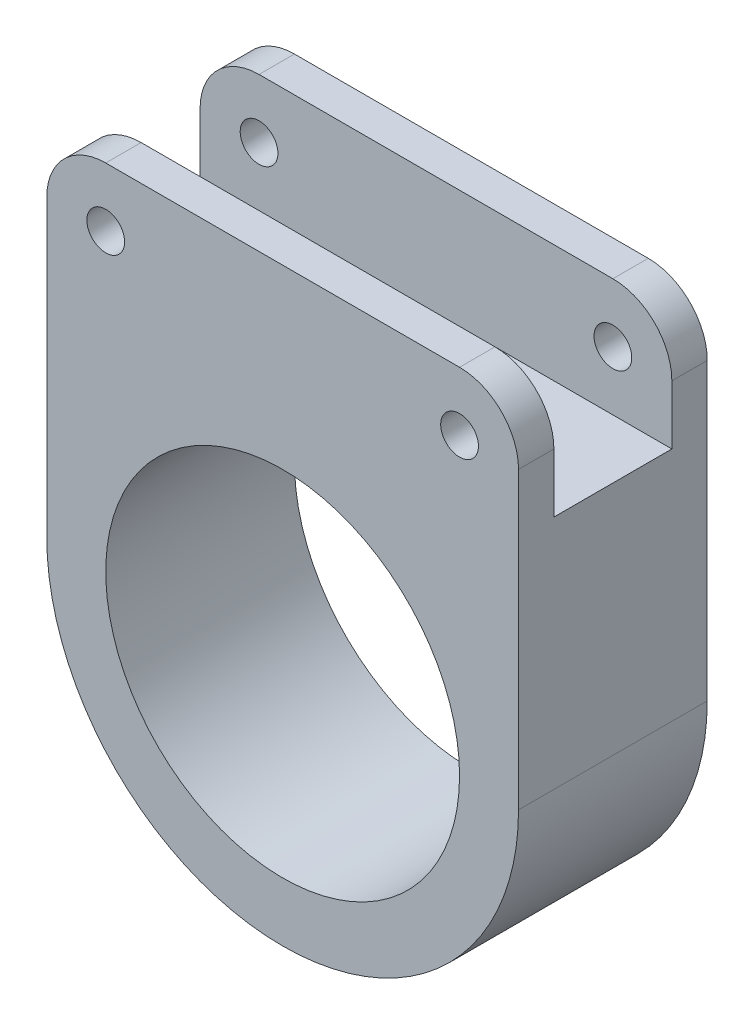
ISO-10303-21;
HEADER;
FILE_DESCRIPTION(('STEP AP214'),'2;1');
FILE_NAME('part.step','',(''),(''),'','','');
FILE_SCHEMA(('AUTOMOTIVE_DESIGN { 1 0 10303 214 1 1 1 1 }'));
ENDSEC;
DATA;
#1=APPLICATION_CONTEXT('core data for automotive mechanical design processes');
#2=APPLICATION_PROTOCOL_DEFINITION('international standard','automotive_design',2000,#1);
#3=PRODUCT_CONTEXT('',#1,'mechanical');
#4=PRODUCT('Part','Part','',(#3));
#5=PRODUCT_RELATED_PRODUCT_CATEGORY('part','',(#4));
#6=PRODUCT_DEFINITION_FORMATION('','',#4);
#7=PRODUCT_DEFINITION_CONTEXT('part definition',#1,'design');
#8=PRODUCT_DEFINITION('design','',#6,#7);
#9=PRODUCT_DEFINITION_SHAPE('','',#8);
#10=(LENGTH_UNIT() NAMED_UNIT(*) SI_UNIT(.MILLI.,.METRE.));
#11=(NAMED_UNIT(*) PLANE_ANGLE_UNIT() SI_UNIT($,.RADIAN.));
#12=(NAMED_UNIT(*) SI_UNIT($,.STERADIAN.) SOLID_ANGLE_UNIT());
#13=UNCERTAINTY_MEASURE_WITH_UNIT(LENGTH_MEASURE(1.E-05),#10,'distance_accuracy_value','');
#14=(GEOMETRIC_REPRESENTATION_CONTEXT(3) GLOBAL_UNCERTAINTY_ASSIGNED_CONTEXT((#13)) GLOBAL_UNIT_ASSIGNED_CONTEXT((#10,
#11,#12)) REPRESENTATION_CONTEXT('',''));
#15=CARTESIAN_POINT('',(0.,0.,0.));
#16=DIRECTION('',(0.,0.,1.));
#17=DIRECTION('',(1.,0.,0.));
#18=AXIS2_PLACEMENT_3D('',#15,#16,#17);
#19=CARTESIAN_POINT('',(0.,25.,16.));
#20=DIRECTION('',(0.,1.,0.));
#21=DIRECTION('',(0.,0.,1.));
#22=AXIS2_PLACEMENT_3D('',#19,#20,#21);
#23=PLANE('',#22);
#24=DIRECTION('',(1.,0.,0.));
#25=VECTOR('',#24,1.);
#26=CARTESIAN_POINT('',(0.,25.,16.));
#27=LINE('',#26,#25);
#28=CARTESIAN_POINT('',(-15.,25.,16.));
#29=VERTEX_POINT('',#28);
#30=CARTESIAN_POINT('',(15.,25.,16.));
#31=VERTEX_POINT('',#30);
#32=EDGE_CURVE('E173',#29,#31,#27,.T.);
#33=ORIENTED_EDGE('',*,*,#32,.T.);
#34=DIRECTION('',(0.,0.,-1.));
#35=VECTOR('',#34,1.);
#36=CARTESIAN_POINT('',(15.,25.,16.));
#37=LINE('',#36,#35);
#38=CARTESIAN_POINT('',(15.,25.,13.));
#39=VERTEX_POINT('',#38);
#40=EDGE_CURVE('E212',#31,#39,#37,.T.);
#41=ORIENTED_EDGE('',*,*,#40,.T.);
#42=DIRECTION('',(1.,0.,0.));
#43=VECTOR('',#42,1.);
#44=CARTESIAN_POINT('',(-20.,25.,13.));
#45=LINE('',#44,#43);
#46=CARTESIAN_POINT('',(-15.,25.,13.));
#47=VERTEX_POINT('',#46);
#48=EDGE_CURVE('E141',#47,#39,#45,.T.);
#49=ORIENTED_EDGE('',*,*,#48,.F.);
#50=DIRECTION('',(0.,0.,-1.));
#51=VECTOR('',#50,1.);
#52=CARTESIAN_POINT('',(-15.,25.,16.));
#53=LINE('',#52,#51);
#54=EDGE_CURVE('E210',#47,#29,#53,.F.);
#55=ORIENTED_EDGE('',*,*,#54,.T.);
#56=EDGE_LOOP('',(#33,#41,#49,#55));
#57=FACE_BOUND('',#56,.T.);
#58=ADVANCED_FACE('F33',(#57),#23,.T.);
#59=CARTESIAN_POINT('',(-15.,20.,16.));
#60=DIRECTION('',(0.,0.,-1.));
#61=DIRECTION('',(-1.,0.,0.));
#62=AXIS2_PLACEMENT_3D('',#59,#60,#61);
#63=CYLINDRICAL_SURFACE('',#62,1.6);
#64=CARTESIAN_POINT('',(-15.,20.,13.));
#65=DIRECTION('',(0.,0.,1.));
#66=DIRECTION('',(1.,0.,0.));
#67=AXIS2_PLACEMENT_3D('',#64,#65,#66);
#68=CIRCLE('',#67,1.6);
#69=CARTESIAN_POINT('',(-13.4,20.,13.));
#70=VERTEX_POINT('',#69);
#71=EDGE_CURVE('E163',#70,#70,#68,.T.);
#72=ORIENTED_EDGE('',*,*,#71,.F.);
#73=EDGE_LOOP('',(#72));
#74=FACE_BOUND('',#73,.T.);
#75=CARTESIAN_POINT('',(-15.,20.,16.));
#76=DIRECTION('',(0.,0.,1.));
#77=DIRECTION('',(1.,0.,0.));
#78=AXIS2_PLACEMENT_3D('',#75,#76,#77);
#79=CIRCLE('',#78,1.6);
#80=CARTESIAN_POINT('',(-13.4,20.,16.));
#81=VERTEX_POINT('',#80);
#82=EDGE_CURVE('E181',#81,#81,#79,.T.);
#83=ORIENTED_EDGE('',*,*,#82,.T.);
#84=EDGE_LOOP('',(#83));
#85=FACE_BOUND('',#84,.T.);
#86=ADVANCED_FACE('F294',(#74,#85),#63,.F.);
#87=CARTESIAN_POINT('',(15.,20.,16.));
#88=DIRECTION('',(0.,0.,-1.));
#89=DIRECTION('',(-1.,0.,0.));
#90=AXIS2_PLACEMENT_3D('',#87,#88,#89);
#91=CYLINDRICAL_SURFACE('',#90,1.6);
#92=CARTESIAN_POINT('',(15.,20.,13.));
#93=DIRECTION('',(0.,0.,1.));
#94=DIRECTION('',(1.,0.,0.));
#95=AXIS2_PLACEMENT_3D('',#92,#93,#94);
#96=CIRCLE('',#95,1.6);
#97=CARTESIAN_POINT('',(16.6,20.,13.));
#98=VERTEX_POINT('',#97);
#99=EDGE_CURVE('E160',#98,#98,#96,.T.);
#100=ORIENTED_EDGE('',*,*,#99,.F.);
#101=EDGE_LOOP('',(#100));
#102=FACE_BOUND('',#101,.T.);
#103=CARTESIAN_POINT('',(15.,20.,16.));
#104=DIRECTION('',(0.,0.,1.));
#105=DIRECTION('',(1.,0.,0.));
#106=AXIS2_PLACEMENT_3D('',#103,#104,#105);
#107=CIRCLE('',#106,1.6);
#108=CARTESIAN_POINT('',(16.6,20.,16.));
#109=VERTEX_POINT('',#108);
#110=EDGE_CURVE('E178',#109,#109,#107,.T.);
#111=ORIENTED_EDGE('',*,*,#110,.T.);
#112=EDGE_LOOP('',(#111));
#113=FACE_BOUND('',#112,.T.);
#114=ADVANCED_FACE('F299',(#102,#113),#91,.F.);
#115=CARTESIAN_POINT('',(0.,-5.,16.));
#116=DIRECTION('',(0.,0.,-1.));
#117=DIRECTION('',(-1.,0.,0.));
#118=AXIS2_PLACEMENT_3D('',#115,#116,#117);
#119=CYLINDRICAL_SURFACE('',#118,20.);
#120=CARTESIAN_POINT('',(0.,-5.,0.));
#121=DIRECTION('',(0.,0.,1.));
#122=DIRECTION('',(1.,0.,0.));
#123=AXIS2_PLACEMENT_3D('',#120,#121,#122);
#124=CIRCLE('',#123,20.);
#125=CARTESIAN_POINT('',(20.,-5.,0.));
#126=VERTEX_POINT('',#125);
#127=CARTESIAN_POINT('',(-20.,-5.,0.));
#128=VERTEX_POINT('',#127);
#129=EDGE_CURVE('E166',#126,#128,#124,.F.);
#130=ORIENTED_EDGE('',*,*,#129,.F.);
#131=DIRECTION('',(0.,0.,-1.));
#132=VECTOR('',#131,1.);
#133=CARTESIAN_POINT('',(20.,-5.,16.));
#134=LINE('',#133,#132);
#135=CARTESIAN_POINT('',(20.,-5.,16.));
#136=VERTEX_POINT('',#135);
#137=EDGE_CURVE('E207',#136,#126,#134,.T.);
#138=ORIENTED_EDGE('',*,*,#137,.F.);
#139=CARTESIAN_POINT('',(0.,-5.,16.));
#140=DIRECTION('',(0.,0.,1.));
#141=DIRECTION('',(1.,0.,0.));
#142=AXIS2_PLACEMENT_3D('',#139,#140,#141);
#143=CIRCLE('',#142,20.);
#144=CARTESIAN_POINT('',(-20.,-5.,16.));
#145=VERTEX_POINT('',#144);
#146=EDGE_CURVE('E167',#136,#145,#143,.F.);
#147=ORIENTED_EDGE('',*,*,#146,.T.);
#148=DIRECTION('',(0.,0.,-1.));
#149=VECTOR('',#148,1.);
#150=CARTESIAN_POINT('',(-20.,-5.,16.));
#151=LINE('',#150,#149);
#152=EDGE_CURVE('E187',#145,#128,#151,.T.);
#153=ORIENTED_EDGE('',*,*,#152,.T.);
#154=EDGE_LOOP('',(#130,#138,#147,#153));
#155=FACE_BOUND('',#154,.T.);
#156=ADVANCED_FACE('F269',(#155),#119,.T.);
#157=CARTESIAN_POINT('',(20.,0.,16.));
#158=DIRECTION('',(1.,0.,0.));
#159=DIRECTION('',(0.,1.,0.));
#160=AXIS2_PLACEMENT_3D('',#157,#158,#159);
#161=PLANE('',#160);
#162=DIRECTION('',(0.,1.,0.));
#163=VECTOR('',#162,1.);
#164=CARTESIAN_POINT('',(20.,15.,13.));
#165=LINE('',#164,#163);
#166=CARTESIAN_POINT('',(20.,15.,13.));
#167=VERTEX_POINT('',#166);
#168=CARTESIAN_POINT('',(20.,20.,13.));
#169=VERTEX_POINT('',#168);
#170=EDGE_CURVE('E157',#167,#169,#165,.T.);
#171=ORIENTED_EDGE('',*,*,#170,.T.);
#172=DIRECTION('',(0.,0.,-1.));
#173=VECTOR('',#172,1.);
#174=CARTESIAN_POINT('',(20.,20.,16.));
#175=LINE('',#174,#173);
#176=CARTESIAN_POINT('',(20.,20.,16.));
#177=VERTEX_POINT('',#176);
#178=EDGE_CURVE('E220',#169,#177,#175,.F.);
#179=ORIENTED_EDGE('',*,*,#178,.T.);
#180=DIRECTION('',(0.,-1.,0.));
#181=VECTOR('',#180,1.);
#182=CARTESIAN_POINT('',(20.,0.,16.));
#183=LINE('',#182,#181);
#184=EDGE_CURVE('E170',#177,#136,#183,.T.);
#185=ORIENTED_EDGE('',*,*,#184,.T.);
#186=ORIENTED_EDGE('',*,*,#137,.T.);
#187=DIRECTION('',(0.,-1.,0.));
#188=VECTOR('',#187,1.);
#189=CARTESIAN_POINT('',(20.,0.,0.));
#190=LINE('',#189,#188);
#191=CARTESIAN_POINT('',(20.,20.,0.));
#192=VERTEX_POINT('',#191);
#193=EDGE_CURVE('E190',#192,#126,#190,.T.);
#194=ORIENTED_EDGE('',*,*,#193,.F.);
#195=DIRECTION('',(0.,0.,-1.));
#196=VECTOR('',#195,1.);
#197=CARTESIAN_POINT('',(20.,20.,16.));
#198=LINE('',#197,#196);
#199=CARTESIAN_POINT('',(20.,20.,3.));
#200=VERTEX_POINT('',#199);
#201=EDGE_CURVE('E146',#192,#200,#198,.F.);
#202=ORIENTED_EDGE('',*,*,#201,.T.);
#203=DIRECTION('',(0.,1.,0.));
#204=VECTOR('',#203,1.);
#205=CARTESIAN_POINT('',(20.,15.,3.));
#206=LINE('',#205,#204);
#207=CARTESIAN_POINT('',(20.,15.,3.));
#208=VERTEX_POINT('',#207);
#209=EDGE_CURVE('E126',#208,#200,#206,.T.);
#210=ORIENTED_EDGE('',*,*,#209,.F.);
#211=DIRECTION('',(0.,0.,-1.));
#212=VECTOR('',#211,1.);
#213=CARTESIAN_POINT('',(20.,15.,3.));
#214=LINE('',#213,#212);
#215=EDGE_CURVE('E132',#167,#208,#214,.T.);
#216=ORIENTED_EDGE('',*,*,#215,.F.);
#217=EDGE_LOOP('',(#171,#179,#185,#186,#194,#202,#210,#216));
#218=FACE_BOUND('',#217,.T.);
#219=ADVANCED_FACE('F143',(#218),#161,.T.);
#220=DIRECTION('',(-1.,0.,0.));
#221=VECTOR('',#220,1.);
#222=CARTESIAN_POINT('',(-20.,25.,3.));
#223=LINE('',#222,#221);
#224=CARTESIAN_POINT('',(15.,25.,3.));
#225=VERTEX_POINT('',#224);
#226=CARTESIAN_POINT('',(-15.,25.,3.));
#227=VERTEX_POINT('',#226);
#228=EDGE_CURVE('E253',#225,#227,#223,.T.);
#229=ORIENTED_EDGE('',*,*,#228,.F.);
#230=DIRECTION('',(0.,0.,-1.));
#231=VECTOR('',#230,1.);
#232=CARTESIAN_POINT('',(15.,25.,16.));
#233=LINE('',#232,#231);
#234=CARTESIAN_POINT('',(15.,25.,0.));
#235=VERTEX_POINT('',#234);
#236=EDGE_CURVE('E228',#225,#235,#233,.T.);
#237=ORIENTED_EDGE('',*,*,#236,.T.);
#238=DIRECTION('',(1.,0.,0.));
#239=VECTOR('',#238,1.);
#240=CARTESIAN_POINT('',(0.,25.,0.));
#241=LINE('',#240,#239);
#242=CARTESIAN_POINT('',(-15.,25.,0.));
#243=VERTEX_POINT('',#242);
#244=EDGE_CURVE('E192',#243,#235,#241,.T.);
#245=ORIENTED_EDGE('',*,*,#244,.F.);
#246=DIRECTION('',(0.,0.,-1.));
#247=VECTOR('',#246,1.);
#248=CARTESIAN_POINT('',(-15.,25.,3.));
#249=LINE('',#248,#247);
#250=EDGE_CURVE('E226',#243,#227,#249,.F.);
#251=ORIENTED_EDGE('',*,*,#250,.T.);
#252=EDGE_LOOP('',(#229,#237,#245,#251));
#253=FACE_BOUND('',#252,.T.);
#254=ADVANCED_FACE('F260',(#253),#23,.T.);
#255=CARTESIAN_POINT('',(-15.,20.,3.));
#256=DIRECTION('',(0.,0.,-1.));
#257=DIRECTION('',(-1.,0.,0.));
#258=AXIS2_PLACEMENT_3D('',#255,#256,#257);
#259=CIRCLE('',#258,1.6);
#260=CARTESIAN_POINT('',(-16.6,20.,3.));
#261=VERTEX_POINT('',#260);
#262=EDGE_CURVE('E156',#261,#261,#259,.T.);
#263=ORIENTED_EDGE('',*,*,#262,.F.);
#264=EDGE_LOOP('',(#263));
#265=FACE_BOUND('',#264,.T.);
#266=CARTESIAN_POINT('',(-15.,20.,0.));
#267=DIRECTION('',(0.,0.,1.));
#268=DIRECTION('',(1.,0.,0.));
#269=AXIS2_PLACEMENT_3D('',#266,#267,#268);
#270=CIRCLE('',#269,1.6);
#271=CARTESIAN_POINT('',(-13.4,20.,0.));
#272=VERTEX_POINT('',#271);
#273=EDGE_CURVE('E200',#272,#272,#270,.T.);
#274=ORIENTED_EDGE('',*,*,#273,.F.);
#275=EDGE_LOOP('',(#274));
#276=FACE_BOUND('',#275,.T.);
#277=ADVANCED_FACE('F302',(#265,#276),#63,.F.);
#278=CARTESIAN_POINT('',(15.,20.,3.));
#279=DIRECTION('',(0.,0.,-1.));
#280=DIRECTION('',(-1.,0.,0.));
#281=AXIS2_PLACEMENT_3D('',#278,#279,#280);
#282=CIRCLE('',#281,1.6);
#283=CARTESIAN_POINT('',(13.4,20.,3.));
#284=VERTEX_POINT('',#283);
#285=EDGE_CURVE('E153',#284,#284,#282,.T.);
#286=ORIENTED_EDGE('',*,*,#285,.F.);
#287=EDGE_LOOP('',(#286));
#288=FACE_BOUND('',#287,.T.);
#289=CARTESIAN_POINT('',(15.,20.,0.));
#290=DIRECTION('',(0.,0.,1.));
#291=DIRECTION('',(1.,0.,0.));
#292=AXIS2_PLACEMENT_3D('',#289,#290,#291);
#293=CIRCLE('',#292,1.6);
#294=CARTESIAN_POINT('',(16.6,20.,0.));
#295=VERTEX_POINT('',#294);
#296=EDGE_CURVE('E197',#295,#295,#293,.T.);
#297=ORIENTED_EDGE('',*,*,#296,.F.);
#298=EDGE_LOOP('',(#297));
#299=FACE_BOUND('',#298,.T.);
#300=ADVANCED_FACE('F310',(#288,#299),#91,.F.);
#301=CARTESIAN_POINT('',(-20.,0.,16.));
#302=DIRECTION('',(1.,0.,0.));
#303=DIRECTION('',(0.,1.,0.));
#304=AXIS2_PLACEMENT_3D('',#301,#302,#303);
#305=PLANE('',#304);
#306=DIRECTION('',(0.,1.,0.));
#307=VECTOR('',#306,1.);
#308=CARTESIAN_POINT('',(-20.,15.,3.));
#309=LINE('',#308,#307);
#310=CARTESIAN_POINT('',(-20.,15.,3.));
#311=VERTEX_POINT('',#310);
#312=CARTESIAN_POINT('',(-20.,20.,3.));
#313=VERTEX_POINT('',#312);
#314=EDGE_CURVE('E128',#311,#313,#309,.T.);
#315=ORIENTED_EDGE('',*,*,#314,.T.);
#316=DIRECTION('',(0.,0.,-1.));
#317=VECTOR('',#316,1.);
#318=CARTESIAN_POINT('',(-20.,20.,0.));
#319=LINE('',#318,#317);
#320=CARTESIAN_POINT('',(-20.,20.,0.));
#321=VERTEX_POINT('',#320);
#322=EDGE_CURVE('E11',#313,#321,#319,.T.);
#323=ORIENTED_EDGE('',*,*,#322,.T.);
#324=DIRECTION('',(0.,-1.,0.));
#325=VECTOR('',#324,1.);
#326=CARTESIAN_POINT('',(-20.,0.,0.));
#327=LINE('',#326,#325);
#328=EDGE_CURVE('E195',#321,#128,#327,.T.);
#329=ORIENTED_EDGE('',*,*,#328,.T.);
#330=ORIENTED_EDGE('',*,*,#152,.F.);
#331=DIRECTION('',(0.,-1.,0.));
#332=VECTOR('',#331,1.);
#333=CARTESIAN_POINT('',(-20.,0.,16.));
#334=LINE('',#333,#332);
#335=CARTESIAN_POINT('',(-20.,20.,16.));
#336=VERTEX_POINT('',#335);
#337=EDGE_CURVE('E176',#336,#145,#334,.T.);
#338=ORIENTED_EDGE('',*,*,#337,.F.);
#339=DIRECTION('',(0.,0.,-1.));
#340=VECTOR('',#339,1.);
#341=CARTESIAN_POINT('',(-20.,20.,13.));
#342=LINE('',#341,#340);
#343=CARTESIAN_POINT('',(-20.,20.,13.));
#344=VERTEX_POINT('',#343);
#345=EDGE_CURVE('E41',#336,#344,#342,.T.);
#346=ORIENTED_EDGE('',*,*,#345,.T.);
#347=DIRECTION('',(0.,1.,0.));
#348=VECTOR('',#347,1.);
#349=CARTESIAN_POINT('',(-20.,15.,13.));
#350=LINE('',#349,#348);
#351=CARTESIAN_POINT('',(-20.,15.,13.));
#352=VERTEX_POINT('',#351);
#353=EDGE_CURVE('E148',#352,#344,#350,.T.);
#354=ORIENTED_EDGE('',*,*,#353,.F.);
#355=DIRECTION('',(0.,0.,1.));
#356=VECTOR('',#355,1.);
#357=CARTESIAN_POINT('',(-20.,15.,3.));
#358=LINE('',#357,#356);
#359=EDGE_CURVE('E131',#311,#352,#358,.T.);
#360=ORIENTED_EDGE('',*,*,#359,.F.);
#361=EDGE_LOOP('',(#315,#323,#329,#330,#338,#346,#354,#360));
#362=FACE_BOUND('',#361,.T.);
#363=ADVANCED_FACE('F242',(#362),#305,.F.);
#364=CARTESIAN_POINT('',(0.,-5.,16.));
#365=DIRECTION('',(0.,0.,-1.));
#366=DIRECTION('',(-1.,0.,0.));
#367=AXIS2_PLACEMENT_3D('',#364,#365,#366);
#368=CYLINDRICAL_SURFACE('',#367,15.);
#369=CARTESIAN_POINT('',(0.,-5.,16.));
#370=DIRECTION('',(0.,0.,1.));
#371=DIRECTION('',(1.,0.,0.));
#372=AXIS2_PLACEMENT_3D('',#369,#370,#371);
#373=CIRCLE('',#372,15.);
#374=CARTESIAN_POINT('',(15.,-5.,16.));
#375=VERTEX_POINT('',#374);
#376=EDGE_CURVE('E184',#375,#375,#373,.T.);
#377=ORIENTED_EDGE('',*,*,#376,.T.);
#378=EDGE_LOOP('',(#377));
#379=FACE_BOUND('',#378,.T.);
#380=CARTESIAN_POINT('',(0.,-5.,0.));
#381=DIRECTION('',(0.,0.,1.));
#382=DIRECTION('',(1.,0.,0.));
#383=AXIS2_PLACEMENT_3D('',#380,#381,#382);
#384=CIRCLE('',#383,15.);
#385=CARTESIAN_POINT('',(15.,-5.,0.));
#386=VERTEX_POINT('',#385);
#387=EDGE_CURVE('E171',#386,#386,#384,.T.);
#388=ORIENTED_EDGE('',*,*,#387,.F.);
#389=EDGE_LOOP('',(#388));
#390=FACE_BOUND('',#389,.T.);
#391=ADVANCED_FACE('F329',(#379,#390),#368,.F.);
#392=CARTESIAN_POINT('',(0.,0.,16.));
#393=DIRECTION('',(0.,0.,1.));
#394=DIRECTION('',(1.,0.,0.));
#395=AXIS2_PLACEMENT_3D('',#392,#393,#394);
#396=PLANE('',#395);
#397=ORIENTED_EDGE('',*,*,#184,.F.);
#398=CARTESIAN_POINT('',(15.,20.,16.));
#399=DIRECTION('',(0.,0.,1.));
#400=DIRECTION('',(1.,0.,0.));
#401=AXIS2_PLACEMENT_3D('',#398,#399,#400);
#402=CIRCLE('',#401,5.);
#403=EDGE_CURVE('E224',#177,#31,#402,.T.);
#404=ORIENTED_EDGE('',*,*,#403,.T.);
#405=ORIENTED_EDGE('',*,*,#32,.F.);
#406=CARTESIAN_POINT('',(-15.,20.,16.));
#407=DIRECTION('',(0.,0.,1.));
#408=DIRECTION('',(1.,0.,0.));
#409=AXIS2_PLACEMENT_3D('',#406,#407,#408);
#410=CIRCLE('',#409,5.);
#411=EDGE_CURVE('E222',#29,#336,#410,.T.);
#412=ORIENTED_EDGE('',*,*,#411,.T.);
#413=ORIENTED_EDGE('',*,*,#337,.T.);
#414=ORIENTED_EDGE('',*,*,#146,.F.);
#415=EDGE_LOOP('',(#397,#404,#405,#412,#413,#414));
#416=FACE_BOUND('',#415,.T.);
#417=ORIENTED_EDGE('',*,*,#110,.F.);
#418=EDGE_LOOP('',(#417));
#419=FACE_BOUND('',#418,.T.);
#420=ORIENTED_EDGE('',*,*,#82,.F.);
#421=EDGE_LOOP('',(#420));
#422=FACE_BOUND('',#421,.T.);
#423=ORIENTED_EDGE('',*,*,#376,.F.);
#424=EDGE_LOOP('',(#423));
#425=FACE_BOUND('',#424,.T.);
#426=ADVANCED_FACE('F274',(#416,#419,#422,#425),#396,.T.);
#427=CARTESIAN_POINT('',(0.,0.,0.));
#428=DIRECTION('',(0.,0.,1.));
#429=DIRECTION('',(1.,0.,0.));
#430=AXIS2_PLACEMENT_3D('',#427,#428,#429);
#431=PLANE('',#430);
#432=ORIENTED_EDGE('',*,*,#244,.T.);
#433=CARTESIAN_POINT('',(15.,20.,0.));
#434=DIRECTION('',(0.,0.,1.));
#435=DIRECTION('',(1.,0.,0.));
#436=AXIS2_PLACEMENT_3D('',#433,#434,#435);
#437=CIRCLE('',#436,5.);
#438=EDGE_CURVE('E232',#235,#192,#437,.F.);
#439=ORIENTED_EDGE('',*,*,#438,.T.);
#440=ORIENTED_EDGE('',*,*,#193,.T.);
#441=ORIENTED_EDGE('',*,*,#129,.T.);
#442=ORIENTED_EDGE('',*,*,#328,.F.);
#443=CARTESIAN_POINT('',(-15.,20.,0.));
#444=DIRECTION('',(0.,0.,1.));
#445=DIRECTION('',(1.,0.,0.));
#446=AXIS2_PLACEMENT_3D('',#443,#444,#445);
#447=CIRCLE('',#446,5.);
#448=EDGE_CURVE('E56',#321,#243,#447,.F.);
#449=ORIENTED_EDGE('',*,*,#448,.T.);
#450=EDGE_LOOP('',(#432,#439,#440,#441,#442,#449));
#451=FACE_BOUND('',#450,.T.);
#452=ORIENTED_EDGE('',*,*,#296,.T.);
#453=EDGE_LOOP('',(#452));
#454=FACE_BOUND('',#453,.T.);
#455=ORIENTED_EDGE('',*,*,#273,.T.);
#456=EDGE_LOOP('',(#455));
#457=FACE_BOUND('',#456,.T.);
#458=ORIENTED_EDGE('',*,*,#387,.T.);
#459=EDGE_LOOP('',(#458));
#460=FACE_BOUND('',#459,.T.);
#461=ADVANCED_FACE('F265',(#451,#454,#457,#460),#431,.F.);
#462=CARTESIAN_POINT('',(-20.,15.,13.));
#463=DIRECTION('',(0.,0.,1.));
#464=DIRECTION('',(1.,0.,0.));
#465=AXIS2_PLACEMENT_3D('',#462,#463,#464);
#466=PLANE('',#465);
#467=ORIENTED_EDGE('',*,*,#71,.T.);
#468=EDGE_LOOP('',(#467));
#469=FACE_BOUND('',#468,.T.);
#470=ORIENTED_EDGE('',*,*,#99,.T.);
#471=EDGE_LOOP('',(#470));
#472=FACE_BOUND('',#471,.T.);
#473=ORIENTED_EDGE('',*,*,#48,.T.);
#474=CARTESIAN_POINT('',(15.,20.,13.));
#475=DIRECTION('',(0.,0.,1.));
#476=DIRECTION('',(1.,0.,0.));
#477=AXIS2_PLACEMENT_3D('',#474,#475,#476);
#478=CIRCLE('',#477,5.);
#479=EDGE_CURVE('E217',#39,#169,#478,.F.);
#480=ORIENTED_EDGE('',*,*,#479,.T.);
#481=ORIENTED_EDGE('',*,*,#170,.F.);
#482=DIRECTION('',(1.,0.,0.));
#483=VECTOR('',#482,1.);
#484=CARTESIAN_POINT('',(-20.,15.,13.));
#485=LINE('',#484,#483);
#486=EDGE_CURVE('E138',#352,#167,#485,.T.);
#487=ORIENTED_EDGE('',*,*,#486,.F.);
#488=ORIENTED_EDGE('',*,*,#353,.T.);
#489=CARTESIAN_POINT('',(-15.,20.,13.));
#490=DIRECTION('',(0.,0.,1.));
#491=DIRECTION('',(1.,0.,0.));
#492=AXIS2_PLACEMENT_3D('',#489,#490,#491);
#493=CIRCLE('',#492,5.);
#494=EDGE_CURVE('E215',#344,#47,#493,.F.);
#495=ORIENTED_EDGE('',*,*,#494,.T.);
#496=EDGE_LOOP('',(#473,#480,#481,#487,#488,#495));
#497=FACE_BOUND('',#496,.T.);
#498=ADVANCED_FACE('F248',(#469,#472,#497),#466,.F.);
#499=CARTESIAN_POINT('',(-20.,15.,3.));
#500=DIRECTION('',(0.,0.,-1.));
#501=DIRECTION('',(-1.,0.,0.));
#502=AXIS2_PLACEMENT_3D('',#499,#500,#501);
#503=PLANE('',#502);
#504=ORIENTED_EDGE('',*,*,#262,.T.);
#505=EDGE_LOOP('',(#504));
#506=FACE_BOUND('',#505,.T.);
#507=ORIENTED_EDGE('',*,*,#285,.T.);
#508=EDGE_LOOP('',(#507));
#509=FACE_BOUND('',#508,.T.);
#510=ORIENTED_EDGE('',*,*,#209,.T.);
#511=CARTESIAN_POINT('',(15.,20.,3.));
#512=DIRECTION('',(0.,0.,-1.));
#513=DIRECTION('',(-1.,0.,0.));
#514=AXIS2_PLACEMENT_3D('',#511,#512,#513);
#515=CIRCLE('',#514,5.);
#516=EDGE_CURVE('E235',#200,#225,#515,.F.);
#517=ORIENTED_EDGE('',*,*,#516,.T.);
#518=ORIENTED_EDGE('',*,*,#228,.T.);
#519=CARTESIAN_POINT('',(-15.,20.,3.));
#520=DIRECTION('',(0.,0.,-1.));
#521=DIRECTION('',(-1.,0.,0.));
#522=AXIS2_PLACEMENT_3D('',#519,#520,#521);
#523=CIRCLE('',#522,5.);
#524=EDGE_CURVE('E48',#227,#313,#523,.F.);
#525=ORIENTED_EDGE('',*,*,#524,.T.);
#526=ORIENTED_EDGE('',*,*,#314,.F.);
#527=DIRECTION('',(-1.,0.,0.));
#528=VECTOR('',#527,1.);
#529=CARTESIAN_POINT('',(-20.,15.,3.));
#530=LINE('',#529,#528);
#531=EDGE_CURVE('E122',#208,#311,#530,.T.);
#532=ORIENTED_EDGE('',*,*,#531,.F.);
#533=EDGE_LOOP('',(#510,#517,#518,#525,#526,#532));
#534=FACE_BOUND('',#533,.T.);
#535=ADVANCED_FACE('F124',(#506,#509,#534),#503,.F.);
#536=CARTESIAN_POINT('',(0.,15.,0.));
#537=DIRECTION('',(0.,1.,0.));
#538=DIRECTION('',(0.,0.,1.));
#539=AXIS2_PLACEMENT_3D('',#536,#537,#538);
#540=PLANE('',#539);
#541=ORIENTED_EDGE('',*,*,#215,.T.);
#542=ORIENTED_EDGE('',*,*,#531,.T.);
#543=ORIENTED_EDGE('',*,*,#359,.T.);
#544=ORIENTED_EDGE('',*,*,#486,.T.);
#545=EDGE_LOOP('',(#541,#542,#543,#544));
#546=FACE_BOUND('',#545,.T.);
#547=ADVANCED_FACE('F136',(#546),#540,.T.);
#548=CARTESIAN_POINT('',(15.,20.,16.));
#549=DIRECTION('',(0.,0.,-1.));
#550=DIRECTION('',(-1.,0.,0.));
#551=AXIS2_PLACEMENT_3D('',#548,#549,#550);
#552=CYLINDRICAL_SURFACE('',#551,5.);
#553=ORIENTED_EDGE('',*,*,#403,.F.);
#554=ORIENTED_EDGE('',*,*,#178,.F.);
#555=ORIENTED_EDGE('',*,*,#479,.F.);
#556=ORIENTED_EDGE('',*,*,#40,.F.);
#557=EDGE_LOOP('',(#553,#554,#555,#556));
#558=FACE_BOUND('',#557,.T.);
#559=ADVANCED_FACE('F283',(#558),#552,.T.);
#560=CARTESIAN_POINT('',(15.,20.,16.));
#561=DIRECTION('',(0.,0.,-1.));
#562=DIRECTION('',(-1.,0.,0.));
#563=AXIS2_PLACEMENT_3D('',#560,#561,#562);
#564=CYLINDRICAL_SURFACE('',#563,5.);
#565=ORIENTED_EDGE('',*,*,#516,.F.);
#566=ORIENTED_EDGE('',*,*,#201,.F.);
#567=ORIENTED_EDGE('',*,*,#438,.F.);
#568=ORIENTED_EDGE('',*,*,#236,.F.);
#569=EDGE_LOOP('',(#565,#566,#567,#568));
#570=FACE_BOUND('',#569,.T.);
#571=ADVANCED_FACE('F263',(#570),#564,.T.);
#572=CARTESIAN_POINT('',(-15.,20.,16.));
#573=DIRECTION('',(0.,0.,1.));
#574=DIRECTION('',(1.,0.,0.));
#575=AXIS2_PLACEMENT_3D('',#572,#573,#574);
#576=CYLINDRICAL_SURFACE('',#575,5.);
#577=ORIENTED_EDGE('',*,*,#524,.F.);
#578=ORIENTED_EDGE('',*,*,#250,.F.);
#579=ORIENTED_EDGE('',*,*,#448,.F.);
#580=ORIENTED_EDGE('',*,*,#322,.F.);
#581=EDGE_LOOP('',(#577,#578,#579,#580));
#582=FACE_BOUND('',#581,.T.);
#583=ADVANCED_FACE('F256',(#582),#576,.T.);
#584=CARTESIAN_POINT('',(-15.,20.,16.));
#585=DIRECTION('',(0.,0.,1.));
#586=DIRECTION('',(1.,0.,0.));
#587=AXIS2_PLACEMENT_3D('',#584,#585,#586);
#588=CYLINDRICAL_SURFACE('',#587,5.);
#589=ORIENTED_EDGE('',*,*,#411,.F.);
#590=ORIENTED_EDGE('',*,*,#54,.F.);
#591=ORIENTED_EDGE('',*,*,#494,.F.);
#592=ORIENTED_EDGE('',*,*,#345,.F.);
#593=EDGE_LOOP('',(#589,#590,#591,#592));
#594=FACE_BOUND('',#593,.T.);
#595=ADVANCED_FACE('F35',(#594),#588,.T.);
#596=CLOSED_SHELL('',(#58,#86,#114,#156,#219,#254,#277,#300,#363,#391,#426,#461,#498,#535,#547,
#559,#571,#583,#595));
#597=MANIFOLD_SOLID_BREP('B2',#596);
#598=ADVANCED_BREP_SHAPE_REPRESENTATION('',(#18,#597),#14);
#599=SHAPE_DEFINITION_REPRESENTATION(#9,#598);
ENDSEC;
END-ISO-10303-21;
